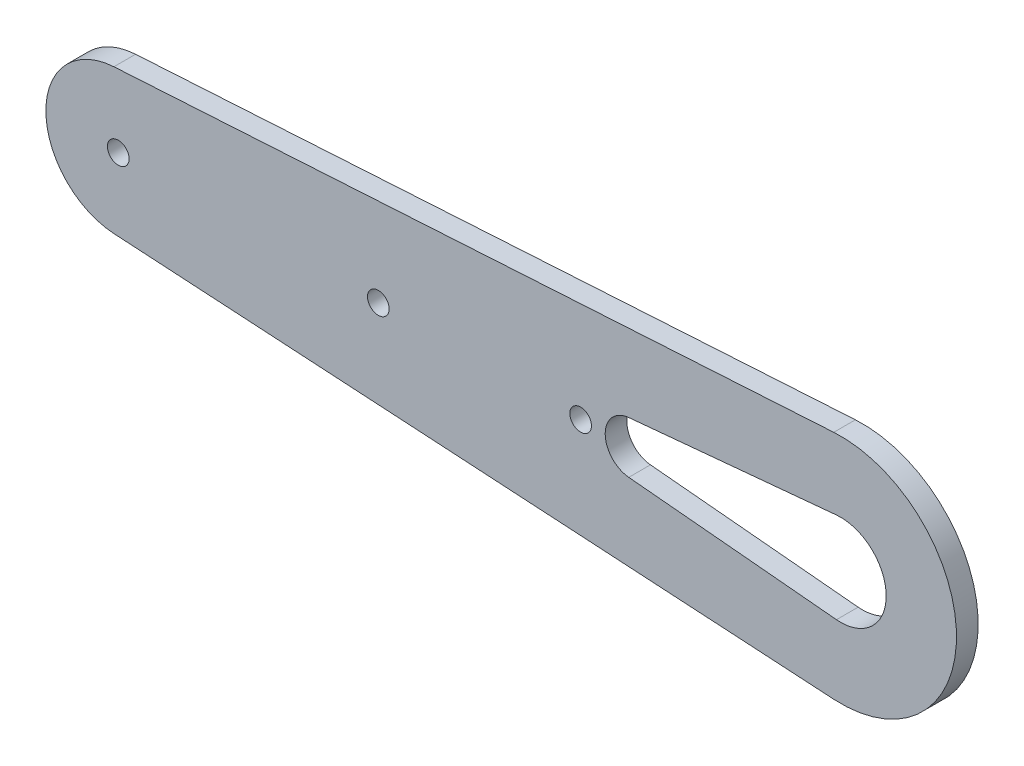
ISO-10303-21;
HEADER;
FILE_DESCRIPTION(('STEP AP214'),'2;1');
FILE_NAME('part.step','',(''),(''),'','','');
FILE_SCHEMA(('AUTOMOTIVE_DESIGN { 1 0 10303 214 1 1 1 1 }'));
ENDSEC;
DATA;
#1=APPLICATION_CONTEXT('core data for automotive mechanical design processes');
#2=APPLICATION_PROTOCOL_DEFINITION('international standard','automotive_design',2000,#1);
#3=PRODUCT_CONTEXT('',#1,'mechanical');
#4=PRODUCT('Part','Part','',(#3));
#5=PRODUCT_RELATED_PRODUCT_CATEGORY('part','',(#4));
#6=PRODUCT_DEFINITION_FORMATION('','',#4);
#7=PRODUCT_DEFINITION_CONTEXT('part definition',#1,'design');
#8=PRODUCT_DEFINITION('design','',#6,#7);
#9=PRODUCT_DEFINITION_SHAPE('','',#8);
#10=(LENGTH_UNIT() NAMED_UNIT(*) SI_UNIT(.MILLI.,.METRE.));
#11=(NAMED_UNIT(*) PLANE_ANGLE_UNIT() SI_UNIT($,.RADIAN.));
#12=(NAMED_UNIT(*) SI_UNIT($,.STERADIAN.) SOLID_ANGLE_UNIT());
#13=UNCERTAINTY_MEASURE_WITH_UNIT(LENGTH_MEASURE(1.E-05),#10,'distance_accuracy_value','');
#14=(GEOMETRIC_REPRESENTATION_CONTEXT(3) GLOBAL_UNCERTAINTY_ASSIGNED_CONTEXT((#13)) GLOBAL_UNIT_ASSIGNED_CONTEXT((#10,
#11,#12)) REPRESENTATION_CONTEXT('',''));
#15=CARTESIAN_POINT('',(0.,0.,0.));
#16=DIRECTION('',(0.,0.,1.));
#17=DIRECTION('',(1.,0.,0.));
#18=AXIS2_PLACEMENT_3D('',#15,#16,#17);
#19=CARTESIAN_POINT('',(-51.9080274262615,-12.3132739904824,3.));
#20=DIRECTION('',(0.,0.,-1.));
#21=DIRECTION('',(-1.,0.,0.));
#22=AXIS2_PLACEMENT_3D('',#19,#20,#21);
#23=CYLINDRICAL_SURFACE('',#22,10.0181143717625);
#24=CARTESIAN_POINT('',(-51.9080274262615,-12.3132739904824,0.));
#25=DIRECTION('',(0.,0.,1.));
#26=DIRECTION('',(-1.,0.,0.));
#27=AXIS2_PLACEMENT_3D('',#24,#25,#26);
#28=CIRCLE('',#27,10.0181143717625);
#29=CARTESIAN_POINT('',(-52.5102031196558,-2.31327399048244,0.));
#30=VERTEX_POINT('',#29);
#31=CARTESIAN_POINT('',(-52.5102031196558,-22.3132739904824,0.));
#32=VERTEX_POINT('',#31);
#33=EDGE_CURVE('E154',#30,#32,#28,.T.);
#34=ORIENTED_EDGE('',*,*,#33,.T.);
#35=DIRECTION('',(0.,0.,-1.));
#36=VECTOR('',#35,1.);
#37=CARTESIAN_POINT('',(-52.5102031196558,-22.3132739904824,3.));
#38=LINE('',#37,#36);
#39=CARTESIAN_POINT('',(-52.5102031196558,-22.3132739904824,3.));
#40=VERTEX_POINT('',#39);
#41=EDGE_CURVE('E11',#40,#32,#38,.T.);
#42=ORIENTED_EDGE('',*,*,#41,.F.);
#43=CARTESIAN_POINT('',(-51.9080274262615,-12.3132739904824,3.));
#44=DIRECTION('',(0.,0.,1.));
#45=DIRECTION('',(-1.,0.,0.));
#46=AXIS2_PLACEMENT_3D('',#43,#44,#45);
#47=CIRCLE('',#46,10.0181143717625);
#48=CARTESIAN_POINT('',(-52.5102031196558,-2.31327399048244,3.));
#49=VERTEX_POINT('',#48);
#50=EDGE_CURVE('E183',#49,#40,#47,.T.);
#51=ORIENTED_EDGE('',*,*,#50,.F.);
#52=DIRECTION('',(0.,0.,-1.));
#53=VECTOR('',#52,1.);
#54=CARTESIAN_POINT('',(-52.5102031196558,-2.31327399048244,3.));
#55=LINE('',#54,#53);
#56=EDGE_CURVE('E197',#49,#30,#55,.T.);
#57=ORIENTED_EDGE('',*,*,#56,.T.);
#58=EDGE_LOOP('',(#34,#42,#51,#57));
#59=FACE_BOUND('',#58,.T.);
#60=ADVANCED_FACE('F45',(#59),#23,.T.);
#61=CARTESIAN_POINT('',(47.1284914643076,-28.3132739904824,3.));
#62=DIRECTION('',(0.0601086862305752,0.998191838195261,0.));
#63=DIRECTION('',(-0.998191838195261,0.0601086862305752,0.));
#64=AXIS2_PLACEMENT_3D('',#61,#62,#63);
#65=PLANE('',#64);
#66=DIRECTION('',(0.998191838195261,-0.0601086862305752,0.));
#67=VECTOR('',#66,1.);
#68=CARTESIAN_POINT('',(47.1284914643076,-28.3132739904824,0.));
#69=LINE('',#68,#67);
#70=CARTESIAN_POINT('',(47.1284914643076,-28.3132739904824,0.));
#71=VERTEX_POINT('',#70);
#72=EDGE_CURVE('E201',#32,#71,#69,.T.);
#73=ORIENTED_EDGE('',*,*,#72,.T.);
#74=DIRECTION('',(0.,0.,-1.));
#75=VECTOR('',#74,1.);
#76=CARTESIAN_POINT('',(47.1284914643076,-28.3132739904824,3.));
#77=LINE('',#76,#75);
#78=CARTESIAN_POINT('',(47.1284914643076,-28.3132739904824,3.));
#79=VERTEX_POINT('',#78);
#80=EDGE_CURVE('E53',#79,#71,#77,.T.);
#81=ORIENTED_EDGE('',*,*,#80,.F.);
#82=DIRECTION('',(0.998191838195261,-0.0601086862305752,0.));
#83=VECTOR('',#82,1.);
#84=CARTESIAN_POINT('',(47.1284914643076,-28.3132739904824,3.));
#85=LINE('',#84,#83);
#86=EDGE_CURVE('E187',#40,#79,#85,.T.);
#87=ORIENTED_EDGE('',*,*,#86,.F.);
#88=ORIENTED_EDGE('',*,*,#41,.T.);
#89=EDGE_LOOP('',(#73,#81,#87,#88));
#90=FACE_BOUND('',#89,.T.);
#91=ADVANCED_FACE('F236',(#90),#65,.F.);
#92=CARTESIAN_POINT('',(48.0919725737385,-12.3132739904824,3.));
#93=DIRECTION('',(0.,0.,-1.));
#94=DIRECTION('',(-1.,0.,0.));
#95=AXIS2_PLACEMENT_3D('',#92,#93,#94);
#96=CYLINDRICAL_SURFACE('',#95,16.02898299482);
#97=CARTESIAN_POINT('',(48.0919725737385,-12.3132739904824,0.));
#98=DIRECTION('',(0.,0.,1.));
#99=DIRECTION('',(-1.,0.,0.));
#100=AXIS2_PLACEMENT_3D('',#97,#98,#99);
#101=CIRCLE('',#100,16.02898299482);
#102=CARTESIAN_POINT('',(47.1284914643076,3.68672600951756,0.));
#103=VERTEX_POINT('',#102);
#104=EDGE_CURVE('E204',#71,#103,#101,.T.);
#105=ORIENTED_EDGE('',*,*,#104,.T.);
#106=DIRECTION('',(0.,0.,-1.));
#107=VECTOR('',#106,1.);
#108=CARTESIAN_POINT('',(47.1284914643076,3.68672600951756,3.));
#109=LINE('',#108,#107);
#110=CARTESIAN_POINT('',(47.1284914643076,3.68672600951756,3.));
#111=VERTEX_POINT('',#110);
#112=EDGE_CURVE('E212',#111,#103,#109,.T.);
#113=ORIENTED_EDGE('',*,*,#112,.F.);
#114=CARTESIAN_POINT('',(48.0919725737385,-12.3132739904824,3.));
#115=DIRECTION('',(0.,0.,1.));
#116=DIRECTION('',(-1.,0.,0.));
#117=AXIS2_PLACEMENT_3D('',#114,#115,#116);
#118=CIRCLE('',#117,16.02898299482);
#119=EDGE_CURVE('E191',#79,#111,#118,.T.);
#120=ORIENTED_EDGE('',*,*,#119,.F.);
#121=ORIENTED_EDGE('',*,*,#80,.T.);
#122=EDGE_LOOP('',(#105,#113,#120,#121));
#123=FACE_BOUND('',#122,.T.);
#124=ADVANCED_FACE('F221',(#123),#96,.T.);
#125=CARTESIAN_POINT('',(-52.5102031196558,-2.31327399048244,3.));
#126=DIRECTION('',(0.0601086862305751,-0.998191838195261,0.));
#127=DIRECTION('',(0.998191838195261,0.0601086862305751,0.));
#128=AXIS2_PLACEMENT_3D('',#125,#126,#127);
#129=PLANE('',#128);
#130=DIRECTION('',(-0.998191838195261,-0.0601086862305751,0.));
#131=VECTOR('',#130,1.);
#132=CARTESIAN_POINT('',(-52.5102031196558,-2.31327399048244,0.));
#133=LINE('',#132,#131);
#134=EDGE_CURVE('E188',#103,#30,#133,.T.);
#135=ORIENTED_EDGE('',*,*,#134,.T.);
#136=ORIENTED_EDGE('',*,*,#56,.F.);
#137=DIRECTION('',(-0.998191838195261,-0.0601086862305751,0.));
#138=VECTOR('',#137,1.);
#139=CARTESIAN_POINT('',(-52.5102031196558,-2.31327399048244,3.));
#140=LINE('',#139,#138);
#141=EDGE_CURVE('E194',#111,#49,#140,.T.);
#142=ORIENTED_EDGE('',*,*,#141,.F.);
#143=ORIENTED_EDGE('',*,*,#112,.T.);
#144=EDGE_LOOP('',(#135,#136,#142,#143));
#145=FACE_BOUND('',#144,.T.);
#146=ADVANCED_FACE('F229',(#145),#129,.F.);
#147=CARTESIAN_POINT('',(-51.9080274262615,-12.3132739904824,3.));
#148=DIRECTION('',(0.,0.,-1.));
#149=DIRECTION('',(-1.,0.,0.));
#150=AXIS2_PLACEMENT_3D('',#147,#148,#149);
#151=PLANE('',#150);
#152=DIRECTION('',(0.995656440705901,-0.093103448275862,0.));
#153=VECTOR('',#152,1.);
#154=CARTESIAN_POINT('',(47.5054208496005,-18.5859095669296,3.));
#155=LINE('',#154,#153);
#156=CARTESIAN_POINT('',(18.7568001599454,-15.8976371770237,3.));
#157=VERTEX_POINT('',#156);
#158=CARTESIAN_POINT('',(47.5054208496005,-18.5859095669296,3.));
#159=VERTEX_POINT('',#158);
#160=EDGE_CURVE('E144',#157,#159,#155,.T.);
#161=ORIENTED_EDGE('',*,*,#160,.F.);
#162=CARTESIAN_POINT('',(19.0919725737385,-12.3132739904824,3.));
#163=DIRECTION('',(0.,0.,1.));
#164=DIRECTION('',(-1.,0.,0.));
#165=AXIS2_PLACEMENT_3D('',#162,#163,#164);
#166=CIRCLE('',#165,3.6);
#167=CARTESIAN_POINT('',(18.7568001599454,-8.72891080394119,3.));
#168=VERTEX_POINT('',#167);
#169=EDGE_CURVE('E60',#168,#157,#166,.T.);
#170=ORIENTED_EDGE('',*,*,#169,.F.);
#171=DIRECTION('',(-0.995656440705901,-0.0931034482758623,0.));
#172=VECTOR('',#171,1.);
#173=CARTESIAN_POINT('',(18.7568001599454,-8.72891080394119,3.));
#174=LINE('',#173,#172);
#175=CARTESIAN_POINT('',(47.5054208496005,-6.04063841403525,3.));
#176=VERTEX_POINT('',#175);
#177=EDGE_CURVE('E131',#176,#168,#174,.T.);
#178=ORIENTED_EDGE('',*,*,#177,.F.);
#179=CARTESIAN_POINT('',(48.0919725737385,-12.3132739904824,3.));
#180=DIRECTION('',(0.,0.,1.));
#181=DIRECTION('',(-1.,0.,0.));
#182=AXIS2_PLACEMENT_3D('',#179,#180,#181);
#183=CIRCLE('',#182,6.30000000000001);
#184=EDGE_CURVE('E135',#159,#176,#183,.T.);
#185=ORIENTED_EDGE('',*,*,#184,.F.);
#186=EDGE_LOOP('',(#161,#170,#178,#185));
#187=FACE_BOUND('',#186,.T.);
#188=CARTESIAN_POINT('',(12.0919725737385,-12.3132739904824,3.));
#189=DIRECTION('',(0.,0.,1.));
#190=DIRECTION('',(1.,0.,0.));
#191=AXIS2_PLACEMENT_3D('',#188,#189,#190);
#192=CIRCLE('',#191,1.5);
#193=CARTESIAN_POINT('',(13.5919725737385,-12.3132739904824,3.));
#194=VERTEX_POINT('',#193);
#195=EDGE_CURVE('E145',#194,#194,#192,.T.);
#196=ORIENTED_EDGE('',*,*,#195,.F.);
#197=EDGE_LOOP('',(#196));
#198=FACE_BOUND('',#197,.T.);
#199=CARTESIAN_POINT('',(-15.9080274262615,-12.3132739904824,3.));
#200=DIRECTION('',(0.,0.,1.));
#201=DIRECTION('',(1.,0.,0.));
#202=AXIS2_PLACEMENT_3D('',#199,#200,#201);
#203=CIRCLE('',#202,1.5);
#204=CARTESIAN_POINT('',(-14.4080274262615,-12.3132739904824,3.));
#205=VERTEX_POINT('',#204);
#206=EDGE_CURVE('E167',#205,#205,#203,.T.);
#207=ORIENTED_EDGE('',*,*,#206,.F.);
#208=EDGE_LOOP('',(#207));
#209=FACE_BOUND('',#208,.T.);
#210=CARTESIAN_POINT('',(-51.9080274262615,-12.3132739904824,3.));
#211=DIRECTION('',(0.,0.,1.));
#212=DIRECTION('',(1.,0.,0.));
#213=AXIS2_PLACEMENT_3D('',#210,#211,#212);
#214=CIRCLE('',#213,1.5);
#215=CARTESIAN_POINT('',(-50.4080274262615,-12.3132739904824,3.));
#216=VERTEX_POINT('',#215);
#217=EDGE_CURVE('E175',#216,#216,#214,.T.);
#218=ORIENTED_EDGE('',*,*,#217,.F.);
#219=EDGE_LOOP('',(#218));
#220=FACE_BOUND('',#219,.T.);
#221=ORIENTED_EDGE('',*,*,#50,.T.);
#222=ORIENTED_EDGE('',*,*,#86,.T.);
#223=ORIENTED_EDGE('',*,*,#119,.T.);
#224=ORIENTED_EDGE('',*,*,#141,.T.);
#225=EDGE_LOOP('',(#221,#222,#223,#224));
#226=FACE_BOUND('',#225,.T.);
#227=ADVANCED_FACE('F235',(#187,#198,#209,#220,#226),#151,.F.);
#228=CARTESIAN_POINT('',(-51.9080274262615,-12.3132739904824,0.));
#229=DIRECTION('',(0.,0.,-1.));
#230=DIRECTION('',(-1.,0.,0.));
#231=AXIS2_PLACEMENT_3D('',#228,#229,#230);
#232=PLANE('',#231);
#233=CARTESIAN_POINT('',(19.0919725737385,-12.3132739904824,0.));
#234=DIRECTION('',(0.,0.,1.));
#235=DIRECTION('',(-1.,0.,0.));
#236=AXIS2_PLACEMENT_3D('',#233,#234,#235);
#237=CIRCLE('',#236,3.6);
#238=CARTESIAN_POINT('',(18.7568001599454,-8.72891080394119,0.));
#239=VERTEX_POINT('',#238);
#240=CARTESIAN_POINT('',(18.7568001599454,-15.8976371770237,0.));
#241=VERTEX_POINT('',#240);
#242=EDGE_CURVE('E112',#239,#241,#237,.T.);
#243=ORIENTED_EDGE('',*,*,#242,.T.);
#244=DIRECTION('',(0.995656440705901,-0.093103448275862,0.));
#245=VECTOR('',#244,1.);
#246=CARTESIAN_POINT('',(47.5054208496005,-18.5859095669296,0.));
#247=LINE('',#246,#245);
#248=CARTESIAN_POINT('',(47.5054208496005,-18.5859095669296,0.));
#249=VERTEX_POINT('',#248);
#250=EDGE_CURVE('E122',#241,#249,#247,.T.);
#251=ORIENTED_EDGE('',*,*,#250,.T.);
#252=CARTESIAN_POINT('',(48.0919725737385,-12.3132739904824,0.));
#253=DIRECTION('',(0.,0.,1.));
#254=DIRECTION('',(-1.,0.,0.));
#255=AXIS2_PLACEMENT_3D('',#252,#253,#254);
#256=CIRCLE('',#255,6.30000000000001);
#257=CARTESIAN_POINT('',(47.5054208496005,-6.04063841403525,0.));
#258=VERTEX_POINT('',#257);
#259=EDGE_CURVE('E68',#249,#258,#256,.T.);
#260=ORIENTED_EDGE('',*,*,#259,.T.);
#261=DIRECTION('',(-0.995656440705901,-0.0931034482758623,0.));
#262=VECTOR('',#261,1.);
#263=CARTESIAN_POINT('',(18.7568001599454,-8.72891080394119,0.));
#264=LINE('',#263,#262);
#265=EDGE_CURVE('E119',#258,#239,#264,.T.);
#266=ORIENTED_EDGE('',*,*,#265,.T.);
#267=EDGE_LOOP('',(#243,#251,#260,#266));
#268=FACE_BOUND('',#267,.T.);
#269=CARTESIAN_POINT('',(12.0919725737385,-12.3132739904824,0.));
#270=DIRECTION('',(0.,0.,1.));
#271=DIRECTION('',(1.,0.,0.));
#272=AXIS2_PLACEMENT_3D('',#269,#270,#271);
#273=CIRCLE('',#272,1.5);
#274=CARTESIAN_POINT('',(13.5919725737385,-12.3132739904824,0.));
#275=VERTEX_POINT('',#274);
#276=EDGE_CURVE('E163',#275,#275,#273,.T.);
#277=ORIENTED_EDGE('',*,*,#276,.T.);
#278=EDGE_LOOP('',(#277));
#279=FACE_BOUND('',#278,.T.);
#280=CARTESIAN_POINT('',(-15.9080274262615,-12.3132739904824,0.));
#281=DIRECTION('',(0.,0.,1.));
#282=DIRECTION('',(1.,0.,0.));
#283=AXIS2_PLACEMENT_3D('',#280,#281,#282);
#284=CIRCLE('',#283,1.5);
#285=CARTESIAN_POINT('',(-14.4080274262615,-12.3132739904824,0.));
#286=VERTEX_POINT('',#285);
#287=EDGE_CURVE('E171',#286,#286,#284,.T.);
#288=ORIENTED_EDGE('',*,*,#287,.T.);
#289=EDGE_LOOP('',(#288));
#290=FACE_BOUND('',#289,.T.);
#291=CARTESIAN_POINT('',(-51.9080274262615,-12.3132739904824,0.));
#292=DIRECTION('',(0.,0.,1.));
#293=DIRECTION('',(1.,0.,0.));
#294=AXIS2_PLACEMENT_3D('',#291,#292,#293);
#295=CIRCLE('',#294,1.5);
#296=CARTESIAN_POINT('',(-50.4080274262615,-12.3132739904824,0.));
#297=VERTEX_POINT('',#296);
#298=EDGE_CURVE('E179',#297,#297,#295,.T.);
#299=ORIENTED_EDGE('',*,*,#298,.T.);
#300=EDGE_LOOP('',(#299));
#301=FACE_BOUND('',#300,.T.);
#302=ORIENTED_EDGE('',*,*,#33,.F.);
#303=ORIENTED_EDGE('',*,*,#134,.F.);
#304=ORIENTED_EDGE('',*,*,#104,.F.);
#305=ORIENTED_EDGE('',*,*,#72,.F.);
#306=EDGE_LOOP('',(#302,#303,#304,#305));
#307=FACE_BOUND('',#306,.T.);
#308=ADVANCED_FACE('F127',(#268,#279,#290,#301,#307),#232,.T.);
#309=CARTESIAN_POINT('',(-51.9080274262615,-12.3132739904824,0.));
#310=DIRECTION('',(0.,0.,1.));
#311=DIRECTION('',(1.,0.,0.));
#312=AXIS2_PLACEMENT_3D('',#309,#310,#311);
#313=CYLINDRICAL_SURFACE('',#312,1.5);
#314=ORIENTED_EDGE('',*,*,#298,.F.);
#315=EDGE_LOOP('',(#314));
#316=FACE_BOUND('',#315,.T.);
#317=ORIENTED_EDGE('',*,*,#217,.T.);
#318=EDGE_LOOP('',(#317));
#319=FACE_BOUND('',#318,.T.);
#320=ADVANCED_FACE('F248',(#316,#319),#313,.F.);
#321=CARTESIAN_POINT('',(-15.9080274262615,-12.3132739904824,0.));
#322=DIRECTION('',(0.,0.,1.));
#323=DIRECTION('',(1.,0.,0.));
#324=AXIS2_PLACEMENT_3D('',#321,#322,#323);
#325=CYLINDRICAL_SURFACE('',#324,1.5);
#326=ORIENTED_EDGE('',*,*,#287,.F.);
#327=EDGE_LOOP('',(#326));
#328=FACE_BOUND('',#327,.T.);
#329=ORIENTED_EDGE('',*,*,#206,.T.);
#330=EDGE_LOOP('',(#329));
#331=FACE_BOUND('',#330,.T.);
#332=ADVANCED_FACE('F254',(#328,#331),#325,.F.);
#333=CARTESIAN_POINT('',(12.0919725737385,-12.3132739904824,0.));
#334=DIRECTION('',(0.,0.,1.));
#335=DIRECTION('',(1.,0.,0.));
#336=AXIS2_PLACEMENT_3D('',#333,#334,#335);
#337=CYLINDRICAL_SURFACE('',#336,1.5);
#338=ORIENTED_EDGE('',*,*,#276,.F.);
#339=EDGE_LOOP('',(#338));
#340=FACE_BOUND('',#339,.T.);
#341=ORIENTED_EDGE('',*,*,#195,.T.);
#342=EDGE_LOOP('',(#341));
#343=FACE_BOUND('',#342,.T.);
#344=ADVANCED_FACE('F258',(#340,#343),#337,.F.);
#345=CARTESIAN_POINT('',(19.0919725737385,-12.3132739904824,0.));
#346=DIRECTION('',(0.,0.,1.));
#347=DIRECTION('',(1.,0.,0.));
#348=AXIS2_PLACEMENT_3D('',#345,#346,#347);
#349=CYLINDRICAL_SURFACE('',#348,3.6);
#350=ORIENTED_EDGE('',*,*,#169,.T.);
#351=DIRECTION('',(0.,0.,1.));
#352=VECTOR('',#351,1.);
#353=CARTESIAN_POINT('',(18.7568001599454,-15.8976371770237,0.));
#354=LINE('',#353,#352);
#355=EDGE_CURVE('E108',#241,#157,#354,.T.);
#356=ORIENTED_EDGE('',*,*,#355,.F.);
#357=ORIENTED_EDGE('',*,*,#242,.F.);
#358=DIRECTION('',(0.,0.,1.));
#359=VECTOR('',#358,1.);
#360=CARTESIAN_POINT('',(18.7568001599454,-8.72891080394119,0.));
#361=LINE('',#360,#359);
#362=EDGE_CURVE('E151',#239,#168,#361,.T.);
#363=ORIENTED_EDGE('',*,*,#362,.T.);
#364=EDGE_LOOP('',(#350,#356,#357,#363));
#365=FACE_BOUND('',#364,.T.);
#366=ADVANCED_FACE('F110',(#365),#349,.F.);
#367=CARTESIAN_POINT('',(18.7568001599454,-8.72891080394119,0.));
#368=DIRECTION('',(-0.0931034482758623,0.995656440705901,0.));
#369=DIRECTION('',(-0.995656440705901,-0.0931034482758623,0.));
#370=AXIS2_PLACEMENT_3D('',#367,#368,#369);
#371=PLANE('',#370);
#372=ORIENTED_EDGE('',*,*,#177,.T.);
#373=ORIENTED_EDGE('',*,*,#362,.F.);
#374=ORIENTED_EDGE('',*,*,#265,.F.);
#375=DIRECTION('',(0.,0.,1.));
#376=VECTOR('',#375,1.);
#377=CARTESIAN_POINT('',(47.5054208496005,-6.04063841403525,0.));
#378=LINE('',#377,#376);
#379=EDGE_CURVE('E155',#258,#176,#378,.T.);
#380=ORIENTED_EDGE('',*,*,#379,.T.);
#381=EDGE_LOOP('',(#372,#373,#374,#380));
#382=FACE_BOUND('',#381,.T.);
#383=ADVANCED_FACE('F265',(#382),#371,.F.);
#384=CARTESIAN_POINT('',(48.0919725737385,-12.3132739904824,0.));
#385=DIRECTION('',(0.,0.,1.));
#386=DIRECTION('',(1.,0.,0.));
#387=AXIS2_PLACEMENT_3D('',#384,#385,#386);
#388=CYLINDRICAL_SURFACE('',#387,6.30000000000001);
#389=ORIENTED_EDGE('',*,*,#184,.T.);
#390=ORIENTED_EDGE('',*,*,#379,.F.);
#391=ORIENTED_EDGE('',*,*,#259,.F.);
#392=DIRECTION('',(0.,0.,1.));
#393=VECTOR('',#392,1.);
#394=CARTESIAN_POINT('',(47.5054208496005,-18.5859095669296,0.));
#395=LINE('',#394,#393);
#396=EDGE_CURVE('E118',#249,#159,#395,.T.);
#397=ORIENTED_EDGE('',*,*,#396,.T.);
#398=EDGE_LOOP('',(#389,#390,#391,#397));
#399=FACE_BOUND('',#398,.T.);
#400=ADVANCED_FACE('F268',(#399),#388,.F.);
#401=CARTESIAN_POINT('',(47.5054208496005,-18.5859095669296,0.));
#402=DIRECTION('',(-0.093103448275862,-0.995656440705901,0.));
#403=DIRECTION('',(0.995656440705901,-0.093103448275862,0.));
#404=AXIS2_PLACEMENT_3D('',#401,#402,#403);
#405=PLANE('',#404);
#406=ORIENTED_EDGE('',*,*,#160,.T.);
#407=ORIENTED_EDGE('',*,*,#396,.F.);
#408=ORIENTED_EDGE('',*,*,#250,.F.);
#409=ORIENTED_EDGE('',*,*,#355,.T.);
#410=EDGE_LOOP('',(#406,#407,#408,#409));
#411=FACE_BOUND('',#410,.T.);
#412=ADVANCED_FACE('F123',(#411),#405,.F.);
#413=CLOSED_SHELL('',(#60,#91,#124,#146,#227,#308,#320,#332,#344,#366,#383,#400,#412));
#414=MANIFOLD_SOLID_BREP('B2',#413);
#415=ADVANCED_BREP_SHAPE_REPRESENTATION('',(#18,#414),#14);
#416=SHAPE_DEFINITION_REPRESENTATION(#9,#415);
ENDSEC;
END-ISO-10303-21;
